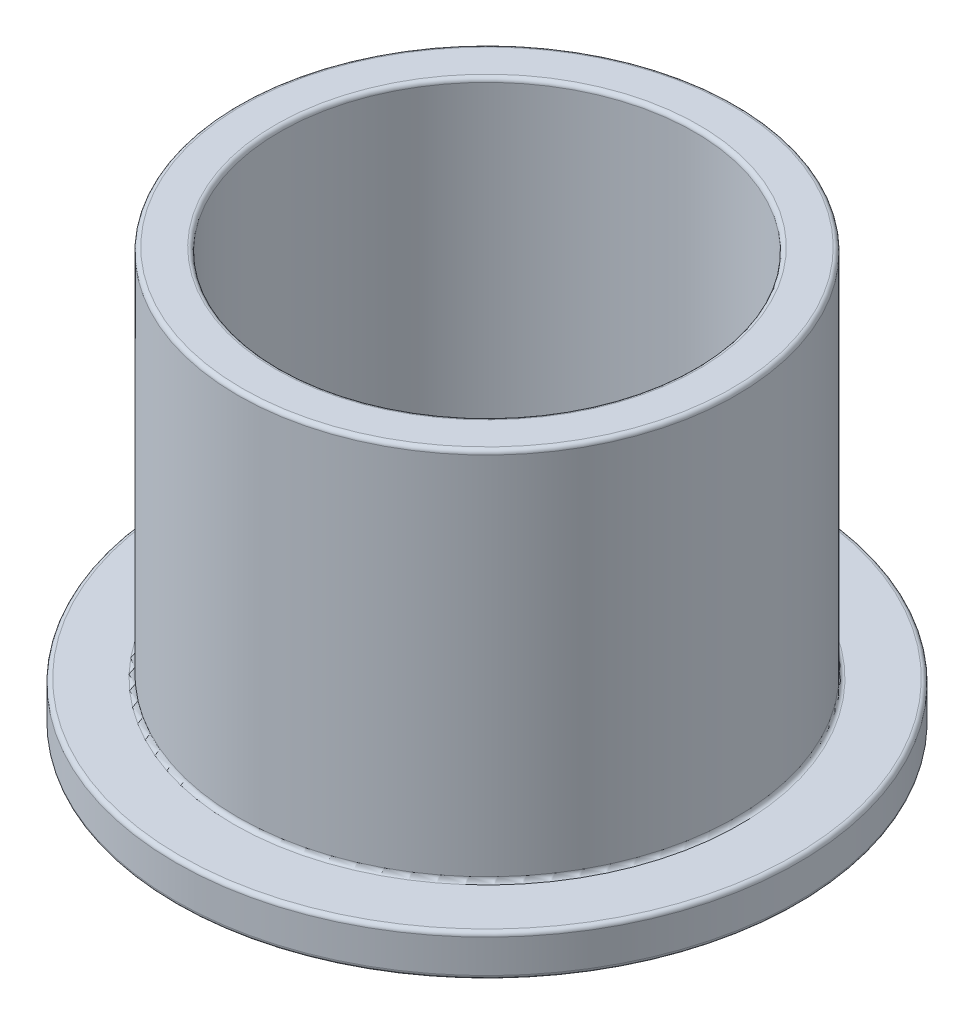
ISO-10303-21;
HEADER;
FILE_DESCRIPTION(('STEP AP214'),'2;1');
FILE_NAME('part.step','',(''),(''),'','','');
FILE_SCHEMA(('AUTOMOTIVE_DESIGN { 1 0 10303 214 1 1 1 1 }'));
ENDSEC;
DATA;
#1=APPLICATION_CONTEXT('core data for automotive mechanical design processes');
#2=APPLICATION_PROTOCOL_DEFINITION('international standard','automotive_design',2000,#1);
#3=PRODUCT_CONTEXT('',#1,'mechanical');
#4=PRODUCT('Part','Part','',(#3));
#5=PRODUCT_RELATED_PRODUCT_CATEGORY('part','',(#4));
#6=PRODUCT_DEFINITION_FORMATION('','',#4);
#7=PRODUCT_DEFINITION_CONTEXT('part definition',#1,'design');
#8=PRODUCT_DEFINITION('design','',#6,#7);
#9=PRODUCT_DEFINITION_SHAPE('','',#8);
#10=(LENGTH_UNIT() NAMED_UNIT(*) SI_UNIT(.MILLI.,.METRE.));
#11=(NAMED_UNIT(*) PLANE_ANGLE_UNIT() SI_UNIT($,.RADIAN.));
#12=(NAMED_UNIT(*) SI_UNIT($,.STERADIAN.) SOLID_ANGLE_UNIT());
#13=UNCERTAINTY_MEASURE_WITH_UNIT(LENGTH_MEASURE(1.E-05),#10,'distance_accuracy_value','');
#14=(GEOMETRIC_REPRESENTATION_CONTEXT(3) GLOBAL_UNCERTAINTY_ASSIGNED_CONTEXT((#13)) GLOBAL_UNIT_ASSIGNED_CONTEXT((#10,
#11,#12)) REPRESENTATION_CONTEXT('',''));
#15=CARTESIAN_POINT('',(0.,0.,0.));
#16=DIRECTION('',(0.,0.,1.));
#17=DIRECTION('',(1.,0.,0.));
#18=AXIS2_PLACEMENT_3D('',#15,#16,#17);
#19=CARTESIAN_POINT('',(0.,8.,0.));
#20=DIRECTION('',(0.,1.,0.));
#21=DIRECTION('',(0.,0.,1.));
#22=AXIS2_PLACEMENT_3D('',#19,#20,#21);
#23=PLANE('',#22);
#24=CARTESIAN_POINT('',(0.,8.,0.));
#25=DIRECTION('',(0.,1.,0.));
#26=DIRECTION('',(0.,0.,1.));
#27=AXIS2_PLACEMENT_3D('',#24,#25,#26);
#28=CIRCLE('',#27,4.08);
#29=CARTESIAN_POINT('',(0.,8.,4.08));
#30=VERTEX_POINT('',#29);
#31=EDGE_CURVE('E10',#30,#30,#28,.F.);
#32=ORIENTED_EDGE('',*,*,#31,.T.);
#33=EDGE_LOOP('',(#32));
#34=FACE_BOUND('',#33,.T.);
#35=CARTESIAN_POINT('',(0.,8.,0.));
#36=DIRECTION('',(0.,1.,0.));
#37=DIRECTION('',(0.,0.,1.));
#38=AXIS2_PLACEMENT_3D('',#35,#36,#37);
#39=CIRCLE('',#38,4.72);
#40=CARTESIAN_POINT('',(0.,8.,4.72));
#41=VERTEX_POINT('',#40);
#42=EDGE_CURVE('E42',#41,#41,#39,.T.);
#43=ORIENTED_EDGE('',*,*,#42,.T.);
#44=EDGE_LOOP('',(#43));
#45=FACE_BOUND('',#44,.T.);
#46=ADVANCED_FACE('F35',(#34,#45),#23,.T.);
#47=CARTESIAN_POINT('',(0.,0.,0.));
#48=DIRECTION('',(0.,1.,0.));
#49=DIRECTION('',(0.,0.,1.));
#50=AXIS2_PLACEMENT_3D('',#47,#48,#49);
#51=PLANE('',#50);
#52=CARTESIAN_POINT('',(0.,0.,0.));
#53=DIRECTION('',(0.,1.,0.));
#54=DIRECTION('',(0.,0.,1.));
#55=AXIS2_PLACEMENT_3D('',#52,#53,#54);
#56=CIRCLE('',#55,4.08);
#57=CARTESIAN_POINT('',(0.,0.,4.08));
#58=VERTEX_POINT('',#57);
#59=EDGE_CURVE('E73',#58,#58,#56,.T.);
#60=ORIENTED_EDGE('',*,*,#59,.T.);
#61=EDGE_LOOP('',(#60));
#62=FACE_BOUND('',#61,.T.);
#63=CARTESIAN_POINT('',(0.,0.,0.));
#64=DIRECTION('',(0.,1.,0.));
#65=DIRECTION('',(0.,0.,1.));
#66=AXIS2_PLACEMENT_3D('',#63,#64,#65);
#67=CIRCLE('',#66,5.92);
#68=CARTESIAN_POINT('',(0.,0.,5.92));
#69=VERTEX_POINT('',#68);
#70=EDGE_CURVE('E76',#69,#69,#67,.F.);
#71=ORIENTED_EDGE('',*,*,#70,.T.);
#72=EDGE_LOOP('',(#71));
#73=FACE_BOUND('',#72,.T.);
#74=ADVANCED_FACE('F80',(#62,#73),#51,.F.);
#75=CARTESIAN_POINT('',(0.,8.,0.));
#76=DIRECTION('',(0.,-1.,0.));
#77=DIRECTION('',(0.,0.,-1.));
#78=AXIS2_PLACEMENT_3D('',#75,#76,#77);
#79=CYLINDRICAL_SURFACE('',#78,4.8);
#80=CARTESIAN_POINT('',(0.,0.88,0.));
#81=DIRECTION('',(0.,1.,0.));
#82=DIRECTION('',(0.,0.,1.));
#83=AXIS2_PLACEMENT_3D('',#80,#81,#82);
#84=CIRCLE('',#83,4.8);
#85=CARTESIAN_POINT('',(0.,0.88,4.8));
#86=VERTEX_POINT('',#85);
#87=EDGE_CURVE('E55',#86,#86,#84,.T.);
#88=ORIENTED_EDGE('',*,*,#87,.T.);
#89=EDGE_LOOP('',(#88));
#90=FACE_BOUND('',#89,.T.);
#91=CARTESIAN_POINT('',(0.,7.92,0.));
#92=DIRECTION('',(0.,1.,0.));
#93=DIRECTION('',(0.,0.,1.));
#94=AXIS2_PLACEMENT_3D('',#91,#92,#93);
#95=CIRCLE('',#94,4.8);
#96=CARTESIAN_POINT('',(0.,7.92,4.8));
#97=VERTEX_POINT('',#96);
#98=EDGE_CURVE('E58',#97,#97,#95,.F.);
#99=ORIENTED_EDGE('',*,*,#98,.T.);
#100=EDGE_LOOP('',(#99));
#101=FACE_BOUND('',#100,.T.);
#102=ADVANCED_FACE('F111',(#90,#101),#79,.T.);
#103=CARTESIAN_POINT('',(0.,8.,0.));
#104=DIRECTION('',(0.,-1.,0.));
#105=DIRECTION('',(0.,0.,-1.));
#106=AXIS2_PLACEMENT_3D('',#103,#104,#105);
#107=CYLINDRICAL_SURFACE('',#106,4.);
#108=CARTESIAN_POINT('',(0.,0.0800000000000002,0.));
#109=DIRECTION('',(0.,1.,0.));
#110=DIRECTION('',(0.,0.,1.));
#111=AXIS2_PLACEMENT_3D('',#108,#109,#110);
#112=CIRCLE('',#111,4.);
#113=CARTESIAN_POINT('',(0.,0.0800000000000002,4.));
#114=VERTEX_POINT('',#113);
#115=EDGE_CURVE('E67',#114,#114,#112,.F.);
#116=ORIENTED_EDGE('',*,*,#115,.T.);
#117=EDGE_LOOP('',(#116));
#118=FACE_BOUND('',#117,.T.);
#119=CARTESIAN_POINT('',(0.,7.92,0.));
#120=DIRECTION('',(0.,1.,0.));
#121=DIRECTION('',(0.,0.,1.));
#122=AXIS2_PLACEMENT_3D('',#119,#120,#121);
#123=CIRCLE('',#122,4.);
#124=CARTESIAN_POINT('',(0.,7.92,4.));
#125=VERTEX_POINT('',#124);
#126=EDGE_CURVE('E70',#125,#125,#123,.T.);
#127=ORIENTED_EDGE('',*,*,#126,.T.);
#128=EDGE_LOOP('',(#127));
#129=FACE_BOUND('',#128,.T.);
#130=ADVANCED_FACE('F105',(#118,#129),#107,.F.);
#131=CARTESIAN_POINT('',(0.,0.8,0.));
#132=DIRECTION('',(0.,1.,0.));
#133=DIRECTION('',(0.,0.,1.));
#134=AXIS2_PLACEMENT_3D('',#131,#132,#133);
#135=PLANE('',#134);
#136=CARTESIAN_POINT('',(0.,0.8,0.));
#137=DIRECTION('',(0.,1.,0.));
#138=DIRECTION('',(0.,0.,1.));
#139=AXIS2_PLACEMENT_3D('',#136,#137,#138);
#140=CIRCLE('',#139,4.88);
#141=CARTESIAN_POINT('',(0.,0.8,4.88));
#142=VERTEX_POINT('',#141);
#143=EDGE_CURVE('E46',#142,#142,#140,.F.);
#144=ORIENTED_EDGE('',*,*,#143,.T.);
#145=EDGE_LOOP('',(#144));
#146=FACE_BOUND('',#145,.T.);
#147=CARTESIAN_POINT('',(0.,0.8,0.));
#148=DIRECTION('',(0.,1.,0.));
#149=DIRECTION('',(0.,0.,1.));
#150=AXIS2_PLACEMENT_3D('',#147,#148,#149);
#151=CIRCLE('',#150,5.92);
#152=CARTESIAN_POINT('',(0.,0.8,5.92));
#153=VERTEX_POINT('',#152);
#154=EDGE_CURVE('E50',#153,#153,#151,.T.);
#155=ORIENTED_EDGE('',*,*,#154,.T.);
#156=EDGE_LOOP('',(#155));
#157=FACE_BOUND('',#156,.T.);
#158=ADVANCED_FACE('F93',(#146,#157),#135,.T.);
#159=CARTESIAN_POINT('',(0.,0.8,0.));
#160=DIRECTION('',(0.,-1.,0.));
#161=DIRECTION('',(0.,0.,-1.));
#162=AXIS2_PLACEMENT_3D('',#159,#160,#161);
#163=CYLINDRICAL_SURFACE('',#162,6.);
#164=CARTESIAN_POINT('',(0.,0.08,0.));
#165=DIRECTION('',(0.,1.,0.));
#166=DIRECTION('',(0.,0.,1.));
#167=AXIS2_PLACEMENT_3D('',#164,#165,#166);
#168=CIRCLE('',#167,6.);
#169=CARTESIAN_POINT('',(0.,0.08,6.));
#170=VERTEX_POINT('',#169);
#171=EDGE_CURVE('E61',#170,#170,#168,.T.);
#172=ORIENTED_EDGE('',*,*,#171,.T.);
#173=EDGE_LOOP('',(#172));
#174=FACE_BOUND('',#173,.T.);
#175=CARTESIAN_POINT('',(0.,0.72,0.));
#176=DIRECTION('',(0.,1.,0.));
#177=DIRECTION('',(0.,0.,1.));
#178=AXIS2_PLACEMENT_3D('',#175,#176,#177);
#179=CIRCLE('',#178,6.);
#180=CARTESIAN_POINT('',(0.,0.72,6.));
#181=VERTEX_POINT('',#180);
#182=EDGE_CURVE('E64',#181,#181,#179,.F.);
#183=ORIENTED_EDGE('',*,*,#182,.T.);
#184=EDGE_LOOP('',(#183));
#185=FACE_BOUND('',#184,.T.);
#186=ADVANCED_FACE('F90',(#174,#185),#163,.T.);
#187=CARTESIAN_POINT('',(0.,0.0800000000000002,0.));
#188=DIRECTION('',(0.,1.,0.));
#189=DIRECTION('',(0.,0.,1.));
#190=AXIS2_PLACEMENT_3D('',#187,#188,#189);
#191=TOROIDAL_SURFACE('',#190,4.08,0.08);
#192=ORIENTED_EDGE('',*,*,#115,.F.);
#193=EDGE_LOOP('',(#192));
#194=FACE_BOUND('',#193,.T.);
#195=ORIENTED_EDGE('',*,*,#59,.F.);
#196=EDGE_LOOP('',(#195));
#197=FACE_BOUND('',#196,.T.);
#198=ADVANCED_FACE('F86',(#194,#197),#191,.T.);
#199=CARTESIAN_POINT('',(0.,0.08,0.));
#200=DIRECTION('',(0.,1.,0.));
#201=DIRECTION('',(0.,0.,1.));
#202=AXIS2_PLACEMENT_3D('',#199,#200,#201);
#203=TOROIDAL_SURFACE('',#202,5.92,0.08);
#204=ORIENTED_EDGE('',*,*,#70,.F.);
#205=EDGE_LOOP('',(#204));
#206=FACE_BOUND('',#205,.T.);
#207=ORIENTED_EDGE('',*,*,#171,.F.);
#208=EDGE_LOOP('',(#207));
#209=FACE_BOUND('',#208,.T.);
#210=ADVANCED_FACE('F82',(#206,#209),#203,.T.);
#211=CARTESIAN_POINT('',(0.,0.88,0.));
#212=DIRECTION('',(0.,1.,0.));
#213=DIRECTION('',(0.,0.,1.));
#214=AXIS2_PLACEMENT_3D('',#211,#212,#213);
#215=TOROIDAL_SURFACE('',#214,4.88,0.08);
#216=ORIENTED_EDGE('',*,*,#143,.F.);
#217=EDGE_LOOP('',(#216));
#218=FACE_BOUND('',#217,.T.);
#219=ORIENTED_EDGE('',*,*,#87,.F.);
#220=EDGE_LOOP('',(#219));
#221=FACE_BOUND('',#220,.T.);
#222=ADVANCED_FACE('F85',(#218,#221),#215,.F.);
#223=CARTESIAN_POINT('',(0.,0.72,0.));
#224=DIRECTION('',(0.,1.,0.));
#225=DIRECTION('',(0.,0.,1.));
#226=AXIS2_PLACEMENT_3D('',#223,#224,#225);
#227=TOROIDAL_SURFACE('',#226,5.92,0.08);
#228=ORIENTED_EDGE('',*,*,#182,.F.);
#229=EDGE_LOOP('',(#228));
#230=FACE_BOUND('',#229,.T.);
#231=ORIENTED_EDGE('',*,*,#154,.F.);
#232=EDGE_LOOP('',(#231));
#233=FACE_BOUND('',#232,.T.);
#234=ADVANCED_FACE('F97',(#230,#233),#227,.T.);
#235=CARTESIAN_POINT('',(0.,7.92,0.));
#236=DIRECTION('',(0.,1.,0.));
#237=DIRECTION('',(0.,0.,1.));
#238=AXIS2_PLACEMENT_3D('',#235,#236,#237);
#239=TOROIDAL_SURFACE('',#238,4.08,0.08);
#240=ORIENTED_EDGE('',*,*,#31,.F.);
#241=EDGE_LOOP('',(#240));
#242=FACE_BOUND('',#241,.T.);
#243=ORIENTED_EDGE('',*,*,#126,.F.);
#244=EDGE_LOOP('',(#243));
#245=FACE_BOUND('',#244,.T.);
#246=ADVANCED_FACE('F100',(#242,#245),#239,.T.);
#247=CARTESIAN_POINT('',(0.,7.92,0.));
#248=DIRECTION('',(0.,1.,0.));
#249=DIRECTION('',(0.,0.,1.));
#250=AXIS2_PLACEMENT_3D('',#247,#248,#249);
#251=TOROIDAL_SURFACE('',#250,4.72,0.08);
#252=ORIENTED_EDGE('',*,*,#98,.F.);
#253=EDGE_LOOP('',(#252));
#254=FACE_BOUND('',#253,.T.);
#255=ORIENTED_EDGE('',*,*,#42,.F.);
#256=EDGE_LOOP('',(#255));
#257=FACE_BOUND('',#256,.T.);
#258=ADVANCED_FACE('F37',(#254,#257),#251,.T.);
#259=CLOSED_SHELL('',(#46,#74,#102,#130,#158,#186,#198,#210,#222,#234,#246,#258));
#260=MANIFOLD_SOLID_BREP('B2',#259);
#261=ADVANCED_BREP_SHAPE_REPRESENTATION('',(#18,#260),#14);
#262=SHAPE_DEFINITION_REPRESENTATION(#9,#261);
ENDSEC;
END-ISO-10303-21;
